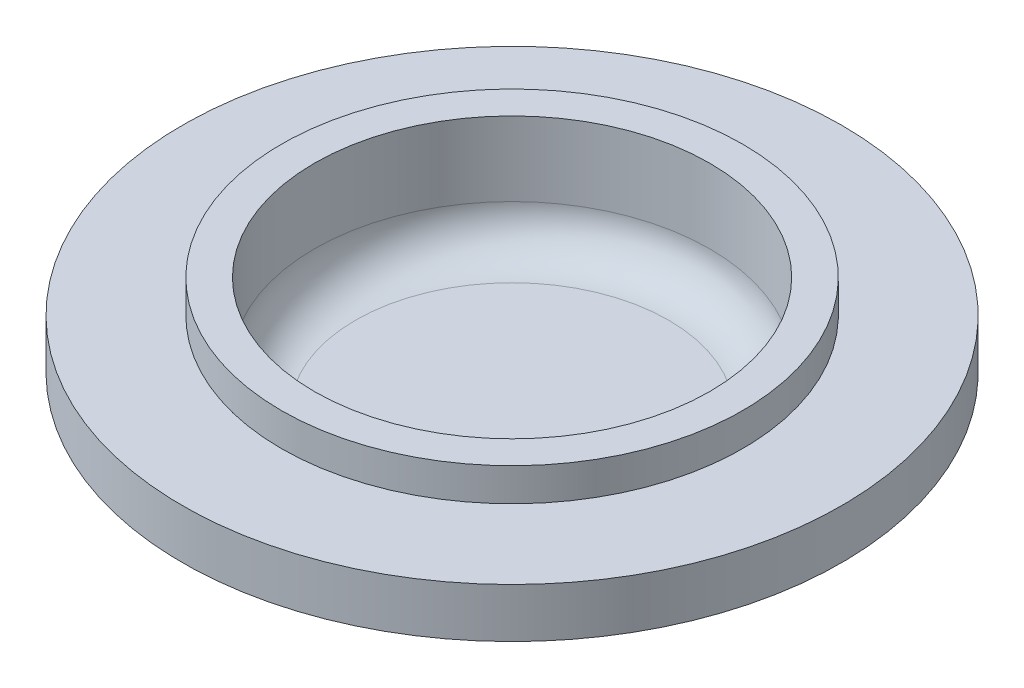
ISO-10303-21;
HEADER;
FILE_DESCRIPTION(('STEP AP214'),'2;1');
FILE_NAME('part.step','',(''),(''),'','','');
FILE_SCHEMA(('AUTOMOTIVE_DESIGN { 1 0 10303 214 1 1 1 1 }'));
ENDSEC;
DATA;
#1=APPLICATION_CONTEXT('core data for automotive mechanical design processes');
#2=APPLICATION_PROTOCOL_DEFINITION('international standard','automotive_design',2000,#1);
#3=PRODUCT_CONTEXT('',#1,'mechanical');
#4=PRODUCT('Part','Part','',(#3));
#5=PRODUCT_RELATED_PRODUCT_CATEGORY('part','',(#4));
#6=PRODUCT_DEFINITION_FORMATION('','',#4);
#7=PRODUCT_DEFINITION_CONTEXT('part definition',#1,'design');
#8=PRODUCT_DEFINITION('design','',#6,#7);
#9=PRODUCT_DEFINITION_SHAPE('','',#8);
#10=(LENGTH_UNIT() NAMED_UNIT(*) SI_UNIT(.MILLI.,.METRE.));
#11=(NAMED_UNIT(*) PLANE_ANGLE_UNIT() SI_UNIT($,.RADIAN.));
#12=(NAMED_UNIT(*) SI_UNIT($,.STERADIAN.) SOLID_ANGLE_UNIT());
#13=UNCERTAINTY_MEASURE_WITH_UNIT(LENGTH_MEASURE(1.E-05),#10,'distance_accuracy_value','');
#14=(GEOMETRIC_REPRESENTATION_CONTEXT(3) GLOBAL_UNCERTAINTY_ASSIGNED_CONTEXT((#13)) GLOBAL_UNIT_ASSIGNED_CONTEXT((#10,
#11,#12)) REPRESENTATION_CONTEXT('',''));
#15=CARTESIAN_POINT('',(0.,0.,0.));
#16=DIRECTION('',(0.,0.,1.));
#17=DIRECTION('',(1.,0.,0.));
#18=AXIS2_PLACEMENT_3D('',#15,#16,#17);
#19=CARTESIAN_POINT('',(0.,0.,0.));
#20=DIRECTION('',(0.,-1.,0.));
#21=DIRECTION('',(0.,0.,-1.));
#22=AXIS2_PLACEMENT_3D('',#19,#20,#21);
#23=CYLINDRICAL_SURFACE('',#22,24.);
#24=CARTESIAN_POINT('',(0.,9.,0.));
#25=DIRECTION('',(0.,-1.,0.));
#26=DIRECTION('',(0.,0.,-1.));
#27=AXIS2_PLACEMENT_3D('',#24,#25,#26);
#28=CIRCLE('',#27,24.);
#29=CARTESIAN_POINT('',(0.,9.,-24.));
#30=VERTEX_POINT('',#29);
#31=EDGE_CURVE('E52',#30,#30,#28,.T.);
#32=ORIENTED_EDGE('',*,*,#31,.T.);
#33=EDGE_LOOP('',(#32));
#34=FACE_BOUND('',#33,.T.);
#35=CARTESIAN_POINT('',(0.,18.,0.));
#36=DIRECTION('',(0.,-1.,0.));
#37=DIRECTION('',(0.,0.,-1.));
#38=AXIS2_PLACEMENT_3D('',#35,#36,#37);
#39=CIRCLE('',#38,24.);
#40=CARTESIAN_POINT('',(0.,18.,-24.));
#41=VERTEX_POINT('',#40);
#42=EDGE_CURVE('E57',#41,#41,#39,.T.);
#43=ORIENTED_EDGE('',*,*,#42,.F.);
#44=EDGE_LOOP('',(#43));
#45=FACE_BOUND('',#44,.T.);
#46=ADVANCED_FACE('F37',(#34,#45),#23,.F.);
#47=CARTESIAN_POINT('',(0.,18.,0.));
#48=DIRECTION('',(0.,1.,0.));
#49=DIRECTION('',(0.,0.,1.));
#50=AXIS2_PLACEMENT_3D('',#47,#48,#49);
#51=PLANE('',#50);
#52=ORIENTED_EDGE('',*,*,#42,.T.);
#53=EDGE_LOOP('',(#52));
#54=FACE_BOUND('',#53,.T.);
#55=CARTESIAN_POINT('',(0.,18.,0.));
#56=DIRECTION('',(0.,-1.,0.));
#57=DIRECTION('',(0.,0.,-1.));
#58=AXIS2_PLACEMENT_3D('',#55,#56,#57);
#59=CIRCLE('',#58,28.);
#60=CARTESIAN_POINT('',(0.,18.,-28.));
#61=VERTEX_POINT('',#60);
#62=EDGE_CURVE('E60',#61,#61,#59,.T.);
#63=ORIENTED_EDGE('',*,*,#62,.F.);
#64=EDGE_LOOP('',(#63));
#65=FACE_BOUND('',#64,.T.);
#66=ADVANCED_FACE('F96',(#54,#65),#51,.T.);
#67=CARTESIAN_POINT('',(0.,0.,0.));
#68=DIRECTION('',(0.,-1.,0.));
#69=DIRECTION('',(0.,0.,-1.));
#70=AXIS2_PLACEMENT_3D('',#67,#68,#69);
#71=CYLINDRICAL_SURFACE('',#70,28.);
#72=ORIENTED_EDGE('',*,*,#62,.T.);
#73=EDGE_LOOP('',(#72));
#74=FACE_BOUND('',#73,.T.);
#75=CARTESIAN_POINT('',(0.,14.,0.));
#76=DIRECTION('',(0.,-1.,0.));
#77=DIRECTION('',(0.,0.,-1.));
#78=AXIS2_PLACEMENT_3D('',#75,#76,#77);
#79=CIRCLE('',#78,28.);
#80=CARTESIAN_POINT('',(0.,14.,-28.));
#81=VERTEX_POINT('',#80);
#82=EDGE_CURVE('E63',#81,#81,#79,.T.);
#83=ORIENTED_EDGE('',*,*,#82,.F.);
#84=EDGE_LOOP('',(#83));
#85=FACE_BOUND('',#84,.T.);
#86=ADVANCED_FACE('F92',(#74,#85),#71,.T.);
#87=CARTESIAN_POINT('',(0.,14.,0.));
#88=DIRECTION('',(0.,1.,0.));
#89=DIRECTION('',(0.,0.,1.));
#90=AXIS2_PLACEMENT_3D('',#87,#88,#89);
#91=PLANE('',#90);
#92=ORIENTED_EDGE('',*,*,#82,.T.);
#93=EDGE_LOOP('',(#92));
#94=FACE_BOUND('',#93,.T.);
#95=CARTESIAN_POINT('',(0.,14.,0.));
#96=DIRECTION('',(0.,-1.,0.));
#97=DIRECTION('',(0.,0.,-1.));
#98=AXIS2_PLACEMENT_3D('',#95,#96,#97);
#99=CIRCLE('',#98,40.);
#100=CARTESIAN_POINT('',(0.,14.,-40.));
#101=VERTEX_POINT('',#100);
#102=EDGE_CURVE('E66',#101,#101,#99,.T.);
#103=ORIENTED_EDGE('',*,*,#102,.F.);
#104=EDGE_LOOP('',(#103));
#105=FACE_BOUND('',#104,.T.);
#106=ADVANCED_FACE('F86',(#94,#105),#91,.T.);
#107=CARTESIAN_POINT('',(0.,0.,0.));
#108=DIRECTION('',(0.,-1.,0.));
#109=DIRECTION('',(0.,0.,-1.));
#110=AXIS2_PLACEMENT_3D('',#107,#108,#109);
#111=CYLINDRICAL_SURFACE('',#110,40.);
#112=ORIENTED_EDGE('',*,*,#102,.T.);
#113=EDGE_LOOP('',(#112));
#114=FACE_BOUND('',#113,.T.);
#115=CARTESIAN_POINT('',(0.,8.,0.));
#116=DIRECTION('',(0.,-1.,0.));
#117=DIRECTION('',(0.,0.,-1.));
#118=AXIS2_PLACEMENT_3D('',#115,#116,#117);
#119=CIRCLE('',#118,40.);
#120=CARTESIAN_POINT('',(0.,8.,-40.));
#121=VERTEX_POINT('',#120);
#122=EDGE_CURVE('E69',#121,#121,#119,.T.);
#123=ORIENTED_EDGE('',*,*,#122,.F.);
#124=EDGE_LOOP('',(#123));
#125=FACE_BOUND('',#124,.T.);
#126=ADVANCED_FACE('F81',(#114,#125),#111,.T.);
#127=CARTESIAN_POINT('',(0.,8.,0.));
#128=DIRECTION('',(0.,1.,0.));
#129=DIRECTION('',(0.,0.,1.));
#130=AXIS2_PLACEMENT_3D('',#127,#128,#129);
#131=PLANE('',#130);
#132=CARTESIAN_POINT('',(0.,8.,0.));
#133=DIRECTION('',(0.,-1.,0.));
#134=DIRECTION('',(0.,0.,-1.));
#135=AXIS2_PLACEMENT_3D('',#132,#133,#134);
#136=CIRCLE('',#135,28.);
#137=CARTESIAN_POINT('',(0.,8.,-28.));
#138=VERTEX_POINT('',#137);
#139=EDGE_CURVE('E72',#138,#138,#136,.T.);
#140=ORIENTED_EDGE('',*,*,#139,.F.);
#141=EDGE_LOOP('',(#140));
#142=FACE_BOUND('',#141,.T.);
#143=ORIENTED_EDGE('',*,*,#122,.T.);
#144=EDGE_LOOP('',(#143));
#145=FACE_BOUND('',#144,.T.);
#146=ADVANCED_FACE('F78',(#142,#145),#131,.F.);
#147=CARTESIAN_POINT('',(0.,0.,0.));
#148=DIRECTION('',(0.,-1.,0.));
#149=DIRECTION('',(0.,0.,-1.));
#150=AXIS2_PLACEMENT_3D('',#147,#148,#149);
#151=CYLINDRICAL_SURFACE('',#150,28.);
#152=CARTESIAN_POINT('',(0.,5.,0.));
#153=DIRECTION('',(0.,-1.,0.));
#154=DIRECTION('',(0.,0.,-1.));
#155=AXIS2_PLACEMENT_3D('',#152,#153,#154);
#156=CIRCLE('',#155,28.);
#157=CARTESIAN_POINT('',(0.,5.,-28.));
#158=VERTEX_POINT('',#157);
#159=EDGE_CURVE('E10',#158,#158,#156,.F.);
#160=ORIENTED_EDGE('',*,*,#159,.T.);
#161=EDGE_LOOP('',(#160));
#162=FACE_BOUND('',#161,.T.);
#163=ORIENTED_EDGE('',*,*,#139,.T.);
#164=EDGE_LOOP('',(#163));
#165=FACE_BOUND('',#164,.T.);
#166=ADVANCED_FACE('F76',(#162,#165),#151,.T.);
#167=CARTESIAN_POINT('',(0.,0.,0.));
#168=DIRECTION('',(0.,-1.,0.));
#169=DIRECTION('',(0.,0.,-1.));
#170=AXIS2_PLACEMENT_3D('',#167,#168,#169);
#171=PLANE('',#170);
#172=CARTESIAN_POINT('',(0.,0.,0.));
#173=DIRECTION('',(0.,-1.,0.));
#174=DIRECTION('',(0.,0.,-1.));
#175=AXIS2_PLACEMENT_3D('',#172,#173,#174);
#176=CIRCLE('',#175,23.);
#177=CARTESIAN_POINT('',(0.,0.,-23.));
#178=VERTEX_POINT('',#177);
#179=EDGE_CURVE('E44',#178,#178,#176,.T.);
#180=ORIENTED_EDGE('',*,*,#179,.T.);
#181=EDGE_LOOP('',(#180));
#182=FACE_BOUND('',#181,.T.);
#183=ADVANCED_FACE('F116',(#182),#171,.T.);
#184=CARTESIAN_POINT('',(0.,4.,0.));
#185=DIRECTION('',(0.,-1.,0.));
#186=DIRECTION('',(0.,0.,-1.));
#187=AXIS2_PLACEMENT_3D('',#184,#185,#186);
#188=PLANE('',#187);
#189=CARTESIAN_POINT('',(0.,4.,0.));
#190=DIRECTION('',(0.,-1.,0.));
#191=DIRECTION('',(0.,0.,-1.));
#192=AXIS2_PLACEMENT_3D('',#189,#190,#191);
#193=CIRCLE('',#192,19.);
#194=CARTESIAN_POINT('',(0.,4.,-19.));
#195=VERTEX_POINT('',#194);
#196=EDGE_CURVE('E48',#195,#195,#193,.F.);
#197=ORIENTED_EDGE('',*,*,#196,.T.);
#198=EDGE_LOOP('',(#197));
#199=FACE_BOUND('',#198,.T.);
#200=ADVANCED_FACE('F109',(#199),#188,.F.);
#201=CARTESIAN_POINT('',(0.,9.,0.));
#202=DIRECTION('',(0.,-1.,0.));
#203=DIRECTION('',(0.,0.,-1.));
#204=AXIS2_PLACEMENT_3D('',#201,#202,#203);
#205=TOROIDAL_SURFACE('',#204,19.,5.);
#206=ORIENTED_EDGE('',*,*,#196,.F.);
#207=EDGE_LOOP('',(#206));
#208=FACE_BOUND('',#207,.T.);
#209=ORIENTED_EDGE('',*,*,#31,.F.);
#210=EDGE_LOOP('',(#209));
#211=FACE_BOUND('',#210,.T.);
#212=ADVANCED_FACE('F107',(#208,#211),#205,.F.);
#213=CARTESIAN_POINT('',(0.,5.,0.));
#214=DIRECTION('',(0.,-1.,0.));
#215=DIRECTION('',(0.,0.,-1.));
#216=AXIS2_PLACEMENT_3D('',#213,#214,#215);
#217=TOROIDAL_SURFACE('',#216,23.,5.);
#218=ORIENTED_EDGE('',*,*,#159,.F.);
#219=EDGE_LOOP('',(#218));
#220=FACE_BOUND('',#219,.T.);
#221=ORIENTED_EDGE('',*,*,#179,.F.);
#222=EDGE_LOOP('',(#221));
#223=FACE_BOUND('',#222,.T.);
#224=ADVANCED_FACE('F39',(#220,#223),#217,.T.);
#225=CLOSED_SHELL('',(#46,#66,#86,#106,#126,#146,#166,#183,#200,#212,#224));
#226=MANIFOLD_SOLID_BREP('B2',#225);
#227=ADVANCED_BREP_SHAPE_REPRESENTATION('',(#18,#226),#14);
#228=SHAPE_DEFINITION_REPRESENTATION(#9,#227);
ENDSEC;
END-ISO-10303-21;
